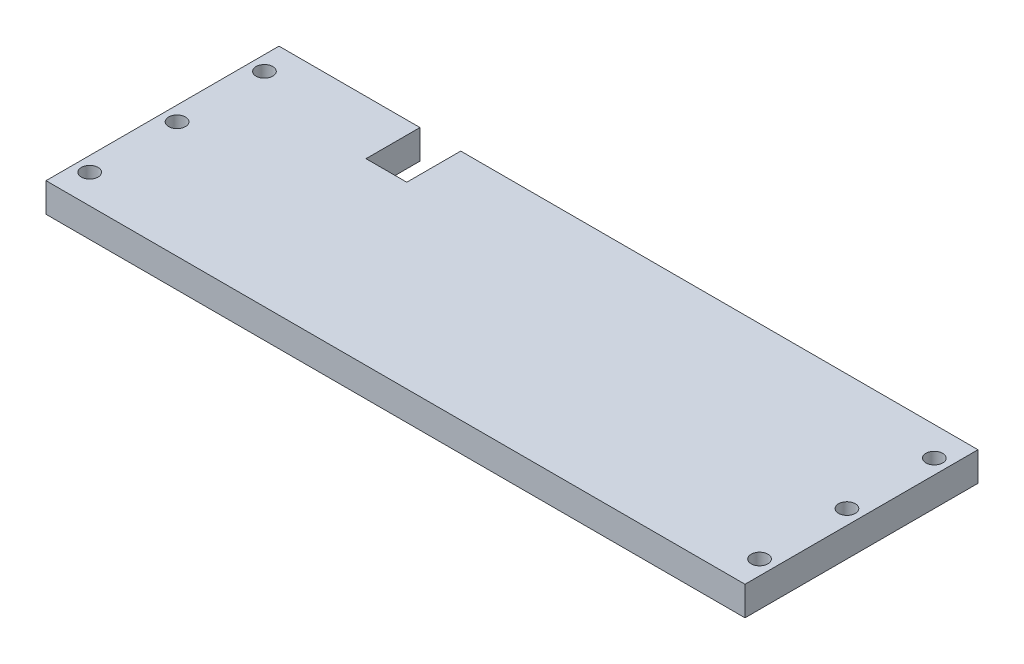
ISO-10303-21;
HEADER;
FILE_DESCRIPTION(('STEP AP214'),'2;1');
FILE_NAME('part.step','',(''),(''),'','','');
FILE_SCHEMA(('AUTOMOTIVE_DESIGN { 1 0 10303 214 1 1 1 1 }'));
ENDSEC;
DATA;
#1=APPLICATION_CONTEXT('core data for automotive mechanical design processes');
#2=APPLICATION_PROTOCOL_DEFINITION('international standard','automotive_design',2000,#1);
#3=PRODUCT_CONTEXT('',#1,'mechanical');
#4=PRODUCT('Part','Part','',(#3));
#5=PRODUCT_RELATED_PRODUCT_CATEGORY('part','',(#4));
#6=PRODUCT_DEFINITION_FORMATION('','',#4);
#7=PRODUCT_DEFINITION_CONTEXT('part definition',#1,'design');
#8=PRODUCT_DEFINITION('design','',#6,#7);
#9=PRODUCT_DEFINITION_SHAPE('','',#8);
#10=(LENGTH_UNIT() NAMED_UNIT(*) SI_UNIT(.MILLI.,.METRE.));
#11=(NAMED_UNIT(*) PLANE_ANGLE_UNIT() SI_UNIT($,.RADIAN.));
#12=(NAMED_UNIT(*) SI_UNIT($,.STERADIAN.) SOLID_ANGLE_UNIT());
#13=UNCERTAINTY_MEASURE_WITH_UNIT(LENGTH_MEASURE(1.E-05),#10,'distance_accuracy_value','');
#14=(GEOMETRIC_REPRESENTATION_CONTEXT(3) GLOBAL_UNCERTAINTY_ASSIGNED_CONTEXT((#13)) GLOBAL_UNIT_ASSIGNED_CONTEXT((#10,
#11,#12)) REPRESENTATION_CONTEXT('',''));
#15=CARTESIAN_POINT('',(0.,0.,0.));
#16=DIRECTION('',(0.,0.,1.));
#17=DIRECTION('',(1.,0.,0.));
#18=AXIS2_PLACEMENT_3D('',#15,#16,#17);
#19=CARTESIAN_POINT('',(0.,6.35,-50.8));
#20=DIRECTION('',(0.,0.,1.));
#21=DIRECTION('',(1.,0.,0.));
#22=AXIS2_PLACEMENT_3D('',#19,#20,#21);
#23=PLANE('',#22);
#24=DIRECTION('',(-1.,0.,0.));
#25=VECTOR('',#24,1.);
#26=CARTESIAN_POINT('',(0.,0.,-50.8));
#27=LINE('',#26,#25);
#28=CARTESIAN_POINT('',(0.,0.,-50.8));
#29=VERTEX_POINT('',#28);
#30=CARTESIAN_POINT('',(-112.776,0.,-50.8));
#31=VERTEX_POINT('',#30);
#32=EDGE_CURVE('E139',#29,#31,#27,.T.);
#33=ORIENTED_EDGE('',*,*,#32,.T.);
#34=DIRECTION('',(0.,1.,0.));
#35=VECTOR('',#34,1.);
#36=CARTESIAN_POINT('',(-112.776,0.,-50.8));
#37=LINE('',#36,#35);
#38=CARTESIAN_POINT('',(-112.776,6.35,-50.8));
#39=VERTEX_POINT('',#38);
#40=EDGE_CURVE('E218',#31,#39,#37,.T.);
#41=ORIENTED_EDGE('',*,*,#40,.T.);
#42=DIRECTION('',(-1.,0.,0.));
#43=VECTOR('',#42,1.);
#44=CARTESIAN_POINT('',(0.,6.35,-50.8));
#45=LINE('',#44,#43);
#46=CARTESIAN_POINT('',(0.,6.35,-50.8));
#47=VERTEX_POINT('',#46);
#48=EDGE_CURVE('E91',#47,#39,#45,.T.);
#49=ORIENTED_EDGE('',*,*,#48,.F.);
#50=DIRECTION('',(0.,-1.,0.));
#51=VECTOR('',#50,1.);
#52=CARTESIAN_POINT('',(0.,6.35,-50.8));
#53=LINE('',#52,#51);
#54=EDGE_CURVE('E11',#47,#29,#53,.T.);
#55=ORIENTED_EDGE('',*,*,#54,.T.);
#56=EDGE_LOOP('',(#33,#41,#49,#55));
#57=FACE_BOUND('',#56,.T.);
#58=ADVANCED_FACE('F38',(#57),#23,.F.);
#59=CARTESIAN_POINT('',(0.,6.35,0.));
#60=DIRECTION('',(-1.,0.,0.));
#61=DIRECTION('',(0.,0.,1.));
#62=AXIS2_PLACEMENT_3D('',#59,#60,#61);
#63=PLANE('',#62);
#64=DIRECTION('',(0.,0.,-1.));
#65=VECTOR('',#64,1.);
#66=CARTESIAN_POINT('',(0.,0.,0.));
#67=LINE('',#66,#65);
#68=CARTESIAN_POINT('',(0.,0.,0.));
#69=VERTEX_POINT('',#68);
#70=EDGE_CURVE('E140',#69,#29,#67,.T.);
#71=ORIENTED_EDGE('',*,*,#70,.T.);
#72=ORIENTED_EDGE('',*,*,#54,.F.);
#73=DIRECTION('',(0.,0.,-1.));
#74=VECTOR('',#73,1.);
#75=CARTESIAN_POINT('',(0.,6.35,0.));
#76=LINE('',#75,#74);
#77=CARTESIAN_POINT('',(0.,6.35,0.));
#78=VERTEX_POINT('',#77);
#79=EDGE_CURVE('E154',#78,#47,#76,.T.);
#80=ORIENTED_EDGE('',*,*,#79,.F.);
#81=DIRECTION('',(0.,-1.,0.));
#82=VECTOR('',#81,1.);
#83=CARTESIAN_POINT('',(0.,6.35,0.));
#84=LINE('',#83,#82);
#85=EDGE_CURVE('E155',#78,#69,#84,.T.);
#86=ORIENTED_EDGE('',*,*,#85,.T.);
#87=EDGE_LOOP('',(#71,#72,#80,#86));
#88=FACE_BOUND('',#87,.T.);
#89=ADVANCED_FACE('F40',(#88),#63,.F.);
#90=CARTESIAN_POINT('',(-121.666,6.35,-50.8));
#91=VERTEX_POINT('',#90);
#92=CARTESIAN_POINT('',(-152.4,6.35,-50.8));
#93=VERTEX_POINT('',#92);
#94=EDGE_CURVE('E131',#91,#93,#45,.T.);
#95=ORIENTED_EDGE('',*,*,#94,.F.);
#96=DIRECTION('',(0.,1.,0.));
#97=VECTOR('',#96,1.);
#98=CARTESIAN_POINT('',(-121.666,0.,-50.8));
#99=LINE('',#98,#97);
#100=CARTESIAN_POINT('',(-121.666,0.,-50.8));
#101=VERTEX_POINT('',#100);
#102=EDGE_CURVE('E117',#101,#91,#99,.T.);
#103=ORIENTED_EDGE('',*,*,#102,.F.);
#104=CARTESIAN_POINT('',(-152.4,0.,-50.8));
#105=VERTEX_POINT('',#104);
#106=EDGE_CURVE('E129',#101,#105,#27,.T.);
#107=ORIENTED_EDGE('',*,*,#106,.T.);
#108=DIRECTION('',(0.,-1.,0.));
#109=VECTOR('',#108,1.);
#110=CARTESIAN_POINT('',(-152.4,6.35,-50.8));
#111=LINE('',#110,#109);
#112=EDGE_CURVE('E47',#93,#105,#111,.T.);
#113=ORIENTED_EDGE('',*,*,#112,.F.);
#114=EDGE_LOOP('',(#95,#103,#107,#113));
#115=FACE_BOUND('',#114,.T.);
#116=ADVANCED_FACE('F127',(#115),#23,.F.);
#117=CARTESIAN_POINT('',(-152.4,6.35,0.));
#118=DIRECTION('',(1.,0.,0.));
#119=DIRECTION('',(0.,0.,-1.));
#120=AXIS2_PLACEMENT_3D('',#117,#118,#119);
#121=PLANE('',#120);
#122=DIRECTION('',(0.,0.,1.));
#123=VECTOR('',#122,1.);
#124=CARTESIAN_POINT('',(-152.4,0.,0.));
#125=LINE('',#124,#123);
#126=CARTESIAN_POINT('',(-152.4,0.,0.));
#127=VERTEX_POINT('',#126);
#128=EDGE_CURVE('E137',#105,#127,#125,.T.);
#129=ORIENTED_EDGE('',*,*,#128,.T.);
#130=DIRECTION('',(0.,-1.,0.));
#131=VECTOR('',#130,1.);
#132=CARTESIAN_POINT('',(-152.4,6.35,0.));
#133=LINE('',#132,#131);
#134=CARTESIAN_POINT('',(-152.4,6.35,0.));
#135=VERTEX_POINT('',#134);
#136=EDGE_CURVE('E158',#135,#127,#133,.T.);
#137=ORIENTED_EDGE('',*,*,#136,.F.);
#138=DIRECTION('',(0.,0.,1.));
#139=VECTOR('',#138,1.);
#140=CARTESIAN_POINT('',(-152.4,6.35,0.));
#141=LINE('',#140,#139);
#142=EDGE_CURVE('E165',#93,#135,#141,.T.);
#143=ORIENTED_EDGE('',*,*,#142,.F.);
#144=ORIENTED_EDGE('',*,*,#112,.T.);
#145=EDGE_LOOP('',(#129,#137,#143,#144));
#146=FACE_BOUND('',#145,.T.);
#147=ADVANCED_FACE('F163',(#146),#121,.F.);
#148=CARTESIAN_POINT('',(0.,6.35,0.));
#149=DIRECTION('',(0.,0.,-1.));
#150=DIRECTION('',(-1.,0.,0.));
#151=AXIS2_PLACEMENT_3D('',#148,#149,#150);
#152=PLANE('',#151);
#153=DIRECTION('',(1.,0.,0.));
#154=VECTOR('',#153,1.);
#155=CARTESIAN_POINT('',(0.,0.,0.));
#156=LINE('',#155,#154);
#157=EDGE_CURVE('E84',#127,#69,#156,.T.);
#158=ORIENTED_EDGE('',*,*,#157,.T.);
#159=ORIENTED_EDGE('',*,*,#85,.F.);
#160=DIRECTION('',(1.,0.,0.));
#161=VECTOR('',#160,1.);
#162=CARTESIAN_POINT('',(0.,6.35,0.));
#163=LINE('',#162,#161);
#164=EDGE_CURVE('E63',#135,#78,#163,.T.);
#165=ORIENTED_EDGE('',*,*,#164,.F.);
#166=ORIENTED_EDGE('',*,*,#136,.T.);
#167=EDGE_LOOP('',(#158,#159,#165,#166));
#168=FACE_BOUND('',#167,.T.);
#169=ADVANCED_FACE('F248',(#168),#152,.F.);
#170=CARTESIAN_POINT('',(0.,6.35,0.));
#171=DIRECTION('',(0.,1.,0.));
#172=DIRECTION('',(0.,0.,1.));
#173=AXIS2_PLACEMENT_3D('',#170,#171,#172);
#174=PLANE('',#173);
#175=DIRECTION('',(0.,0.,-1.));
#176=VECTOR('',#175,1.);
#177=CARTESIAN_POINT('',(-112.776,6.35,-39.0349884222713));
#178=LINE('',#177,#176);
#179=CARTESIAN_POINT('',(-112.776,6.35,-39.0349884222713));
#180=VERTEX_POINT('',#179);
#181=EDGE_CURVE('E123',#180,#39,#178,.T.);
#182=ORIENTED_EDGE('',*,*,#181,.F.);
#183=DIRECTION('',(1.,0.,0.));
#184=VECTOR('',#183,1.);
#185=CARTESIAN_POINT('',(-121.666,6.35,-39.0349884222713));
#186=LINE('',#185,#184);
#187=CARTESIAN_POINT('',(-121.666,6.35,-39.0349884222713));
#188=VERTEX_POINT('',#187);
#189=EDGE_CURVE('E231',#188,#180,#186,.T.);
#190=ORIENTED_EDGE('',*,*,#189,.F.);
#191=DIRECTION('',(0.,0.,1.));
#192=VECTOR('',#191,1.);
#193=CARTESIAN_POINT('',(-121.666,6.35,-50.8));
#194=LINE('',#193,#192);
#195=EDGE_CURVE('E235',#91,#188,#194,.T.);
#196=ORIENTED_EDGE('',*,*,#195,.F.);
#197=ORIENTED_EDGE('',*,*,#94,.T.);
#198=ORIENTED_EDGE('',*,*,#142,.T.);
#199=ORIENTED_EDGE('',*,*,#164,.T.);
#200=ORIENTED_EDGE('',*,*,#79,.T.);
#201=ORIENTED_EDGE('',*,*,#48,.T.);
#202=EDGE_LOOP('',(#182,#190,#196,#197,#198,#199,#200,#201));
#203=FACE_BOUND('',#202,.T.);
#204=CARTESIAN_POINT('',(-149.225,6.35,-25.4));
#205=DIRECTION('',(0.,1.,0.));
#206=DIRECTION('',(0.,0.,1.));
#207=AXIS2_PLACEMENT_3D('',#204,#205,#206);
#208=CIRCLE('',#207,1.82879999999998);
#209=CARTESIAN_POINT('',(-149.225,6.35,-23.5712));
#210=VERTEX_POINT('',#209);
#211=EDGE_CURVE('E207',#210,#210,#208,.T.);
#212=ORIENTED_EDGE('',*,*,#211,.F.);
#213=EDGE_LOOP('',(#212));
#214=FACE_BOUND('',#213,.T.);
#215=CARTESIAN_POINT('',(-149.225,6.35,-6.35));
#216=DIRECTION('',(0.,1.,0.));
#217=DIRECTION('',(0.,0.,1.));
#218=AXIS2_PLACEMENT_3D('',#215,#216,#217);
#219=CIRCLE('',#218,1.82879999999998);
#220=CARTESIAN_POINT('',(-149.225,6.35,-4.52120000000002));
#221=VERTEX_POINT('',#220);
#222=EDGE_CURVE('E199',#221,#221,#219,.T.);
#223=ORIENTED_EDGE('',*,*,#222,.F.);
#224=EDGE_LOOP('',(#223));
#225=FACE_BOUND('',#224,.T.);
#226=CARTESIAN_POINT('',(-3.175,6.35,-25.4));
#227=DIRECTION('',(0.,1.,0.));
#228=DIRECTION('',(0.,0.,1.));
#229=AXIS2_PLACEMENT_3D('',#226,#227,#228);
#230=CIRCLE('',#229,1.8288);
#231=CARTESIAN_POINT('',(-3.175,6.35,-23.5712));
#232=VERTEX_POINT('',#231);
#233=EDGE_CURVE('E191',#232,#232,#230,.T.);
#234=ORIENTED_EDGE('',*,*,#233,.F.);
#235=EDGE_LOOP('',(#234));
#236=FACE_BOUND('',#235,.T.);
#237=CARTESIAN_POINT('',(-3.175,6.35,-44.45));
#238=DIRECTION('',(0.,1.,0.));
#239=DIRECTION('',(0.,0.,1.));
#240=AXIS2_PLACEMENT_3D('',#237,#238,#239);
#241=CIRCLE('',#240,1.8288);
#242=CARTESIAN_POINT('',(-3.175,6.35,-42.6212));
#243=VERTEX_POINT('',#242);
#244=EDGE_CURVE('E182',#243,#243,#241,.T.);
#245=ORIENTED_EDGE('',*,*,#244,.F.);
#246=EDGE_LOOP('',(#245));
#247=FACE_BOUND('',#246,.T.);
#248=CARTESIAN_POINT('',(-3.175,6.35,-6.35));
#249=DIRECTION('',(0.,1.,0.));
#250=DIRECTION('',(0.,0.,1.));
#251=AXIS2_PLACEMENT_3D('',#248,#249,#250);
#252=CIRCLE('',#251,1.8288);
#253=CARTESIAN_POINT('',(-3.175,6.35,-4.5212));
#254=VERTEX_POINT('',#253);
#255=EDGE_CURVE('E214',#254,#254,#252,.T.);
#256=ORIENTED_EDGE('',*,*,#255,.F.);
#257=EDGE_LOOP('',(#256));
#258=FACE_BOUND('',#257,.T.);
#259=CARTESIAN_POINT('',(-149.225,6.35,-44.45));
#260=DIRECTION('',(0.,1.,0.));
#261=DIRECTION('',(0.,0.,1.));
#262=AXIS2_PLACEMENT_3D('',#259,#260,#261);
#263=CIRCLE('',#262,1.82879999999999);
#264=CARTESIAN_POINT('',(-149.225,6.35,-42.6212));
#265=VERTEX_POINT('',#264);
#266=EDGE_CURVE('E174',#265,#265,#263,.T.);
#267=ORIENTED_EDGE('',*,*,#266,.F.);
#268=EDGE_LOOP('',(#267));
#269=FACE_BOUND('',#268,.T.);
#270=ADVANCED_FACE('F250',(#203,#214,#225,#236,#247,#258,#269),#174,.T.);
#271=CARTESIAN_POINT('',(0.,0.,0.));
#272=DIRECTION('',(0.,1.,0.));
#273=DIRECTION('',(0.,0.,1.));
#274=AXIS2_PLACEMENT_3D('',#271,#272,#273);
#275=PLANE('',#274);
#276=CARTESIAN_POINT('',(-149.225,0.,-25.4));
#277=DIRECTION('',(0.,1.,0.));
#278=DIRECTION('',(0.,0.,1.));
#279=AXIS2_PLACEMENT_3D('',#276,#277,#278);
#280=CIRCLE('',#279,1.82879999999998);
#281=CARTESIAN_POINT('',(-149.225,0.,-23.5712));
#282=VERTEX_POINT('',#281);
#283=EDGE_CURVE('E178',#282,#282,#280,.T.);
#284=ORIENTED_EDGE('',*,*,#283,.T.);
#285=EDGE_LOOP('',(#284));
#286=FACE_BOUND('',#285,.T.);
#287=CARTESIAN_POINT('',(-149.225,0.,-6.35));
#288=DIRECTION('',(0.,1.,0.));
#289=DIRECTION('',(0.,0.,1.));
#290=AXIS2_PLACEMENT_3D('',#287,#288,#289);
#291=CIRCLE('',#290,1.82879999999998);
#292=CARTESIAN_POINT('',(-149.225,0.,-4.52120000000002));
#293=VERTEX_POINT('',#292);
#294=EDGE_CURVE('E203',#293,#293,#291,.T.);
#295=ORIENTED_EDGE('',*,*,#294,.T.);
#296=EDGE_LOOP('',(#295));
#297=FACE_BOUND('',#296,.T.);
#298=CARTESIAN_POINT('',(-3.175,0.,-25.4));
#299=DIRECTION('',(0.,1.,0.));
#300=DIRECTION('',(0.,0.,1.));
#301=AXIS2_PLACEMENT_3D('',#298,#299,#300);
#302=CIRCLE('',#301,1.8288);
#303=CARTESIAN_POINT('',(-3.175,0.,-23.5712));
#304=VERTEX_POINT('',#303);
#305=EDGE_CURVE('E195',#304,#304,#302,.T.);
#306=ORIENTED_EDGE('',*,*,#305,.T.);
#307=EDGE_LOOP('',(#306));
#308=FACE_BOUND('',#307,.T.);
#309=CARTESIAN_POINT('',(-3.175,0.,-44.45));
#310=DIRECTION('',(0.,1.,0.));
#311=DIRECTION('',(0.,0.,1.));
#312=AXIS2_PLACEMENT_3D('',#309,#310,#311);
#313=CIRCLE('',#312,1.8288);
#314=CARTESIAN_POINT('',(-3.175,0.,-42.6212));
#315=VERTEX_POINT('',#314);
#316=EDGE_CURVE('E186',#315,#315,#313,.T.);
#317=ORIENTED_EDGE('',*,*,#316,.T.);
#318=EDGE_LOOP('',(#317));
#319=FACE_BOUND('',#318,.T.);
#320=CARTESIAN_POINT('',(-3.175,0.,-6.35));
#321=DIRECTION('',(0.,1.,0.));
#322=DIRECTION('',(0.,0.,1.));
#323=AXIS2_PLACEMENT_3D('',#320,#321,#322);
#324=CIRCLE('',#323,1.8288);
#325=CARTESIAN_POINT('',(-3.175,0.,-4.5212));
#326=VERTEX_POINT('',#325);
#327=EDGE_CURVE('E187',#326,#326,#324,.T.);
#328=ORIENTED_EDGE('',*,*,#327,.T.);
#329=EDGE_LOOP('',(#328));
#330=FACE_BOUND('',#329,.T.);
#331=CARTESIAN_POINT('',(-149.225,0.,-44.45));
#332=DIRECTION('',(0.,1.,0.));
#333=DIRECTION('',(0.,0.,1.));
#334=AXIS2_PLACEMENT_3D('',#331,#332,#333);
#335=CIRCLE('',#334,1.82879999999999);
#336=CARTESIAN_POINT('',(-149.225,0.,-42.6212));
#337=VERTEX_POINT('',#336);
#338=EDGE_CURVE('E146',#337,#337,#335,.T.);
#339=ORIENTED_EDGE('',*,*,#338,.T.);
#340=EDGE_LOOP('',(#339));
#341=FACE_BOUND('',#340,.T.);
#342=DIRECTION('',(1.,0.,0.));
#343=VECTOR('',#342,1.);
#344=CARTESIAN_POINT('',(-121.666,0.,-39.0349884222713));
#345=LINE('',#344,#343);
#346=CARTESIAN_POINT('',(-121.666,0.,-39.0349884222713));
#347=VERTEX_POINT('',#346);
#348=CARTESIAN_POINT('',(-112.776,0.,-39.0349884222713));
#349=VERTEX_POINT('',#348);
#350=EDGE_CURVE('E54',#347,#349,#345,.T.);
#351=ORIENTED_EDGE('',*,*,#350,.T.);
#352=DIRECTION('',(0.,0.,-1.));
#353=VECTOR('',#352,1.);
#354=CARTESIAN_POINT('',(-112.776,0.,-39.0349884222713));
#355=LINE('',#354,#353);
#356=EDGE_CURVE('E133',#349,#31,#355,.T.);
#357=ORIENTED_EDGE('',*,*,#356,.T.);
#358=ORIENTED_EDGE('',*,*,#32,.F.);
#359=ORIENTED_EDGE('',*,*,#70,.F.);
#360=ORIENTED_EDGE('',*,*,#157,.F.);
#361=ORIENTED_EDGE('',*,*,#128,.F.);
#362=ORIENTED_EDGE('',*,*,#106,.F.);
#363=DIRECTION('',(0.,0.,1.));
#364=VECTOR('',#363,1.);
#365=CARTESIAN_POINT('',(-121.666,0.,-50.8));
#366=LINE('',#365,#364);
#367=EDGE_CURVE('E113',#101,#347,#366,.T.);
#368=ORIENTED_EDGE('',*,*,#367,.T.);
#369=EDGE_LOOP('',(#351,#357,#358,#359,#360,#361,#362,#368));
#370=FACE_BOUND('',#369,.T.);
#371=ADVANCED_FACE('F136',(#286,#297,#308,#319,#330,#341,#370),#275,.F.);
#372=CARTESIAN_POINT('',(-149.225,0.,-44.45));
#373=DIRECTION('',(0.,1.,0.));
#374=DIRECTION('',(0.,0.,1.));
#375=AXIS2_PLACEMENT_3D('',#372,#373,#374);
#376=CYLINDRICAL_SURFACE('',#375,1.82879999999999);
#377=ORIENTED_EDGE('',*,*,#338,.F.);
#378=EDGE_LOOP('',(#377));
#379=FACE_BOUND('',#378,.T.);
#380=ORIENTED_EDGE('',*,*,#266,.T.);
#381=EDGE_LOOP('',(#380));
#382=FACE_BOUND('',#381,.T.);
#383=ADVANCED_FACE('F277',(#379,#382),#376,.F.);
#384=CARTESIAN_POINT('',(-3.175,0.,-6.35));
#385=DIRECTION('',(0.,1.,0.));
#386=DIRECTION('',(0.,0.,1.));
#387=AXIS2_PLACEMENT_3D('',#384,#385,#386);
#388=CYLINDRICAL_SURFACE('',#387,1.8288);
#389=ORIENTED_EDGE('',*,*,#327,.F.);
#390=EDGE_LOOP('',(#389));
#391=FACE_BOUND('',#390,.T.);
#392=ORIENTED_EDGE('',*,*,#255,.T.);
#393=EDGE_LOOP('',(#392));
#394=FACE_BOUND('',#393,.T.);
#395=ADVANCED_FACE('F310',(#391,#394),#388,.F.);
#396=CARTESIAN_POINT('',(-3.175,0.,-44.45));
#397=DIRECTION('',(0.,1.,0.));
#398=DIRECTION('',(0.,0.,1.));
#399=AXIS2_PLACEMENT_3D('',#396,#397,#398);
#400=CYLINDRICAL_SURFACE('',#399,1.8288);
#401=ORIENTED_EDGE('',*,*,#316,.F.);
#402=EDGE_LOOP('',(#401));
#403=FACE_BOUND('',#402,.T.);
#404=ORIENTED_EDGE('',*,*,#244,.T.);
#405=EDGE_LOOP('',(#404));
#406=FACE_BOUND('',#405,.T.);
#407=ADVANCED_FACE('F313',(#403,#406),#400,.F.);
#408=CARTESIAN_POINT('',(-3.175,0.,-25.4));
#409=DIRECTION('',(0.,1.,0.));
#410=DIRECTION('',(0.,0.,1.));
#411=AXIS2_PLACEMENT_3D('',#408,#409,#410);
#412=CYLINDRICAL_SURFACE('',#411,1.8288);
#413=ORIENTED_EDGE('',*,*,#305,.F.);
#414=EDGE_LOOP('',(#413));
#415=FACE_BOUND('',#414,.T.);
#416=ORIENTED_EDGE('',*,*,#233,.T.);
#417=EDGE_LOOP('',(#416));
#418=FACE_BOUND('',#417,.T.);
#419=ADVANCED_FACE('F321',(#415,#418),#412,.F.);
#420=CARTESIAN_POINT('',(-149.225,0.,-6.35));
#421=DIRECTION('',(0.,1.,0.));
#422=DIRECTION('',(0.,0.,1.));
#423=AXIS2_PLACEMENT_3D('',#420,#421,#422);
#424=CYLINDRICAL_SURFACE('',#423,1.82879999999998);
#425=ORIENTED_EDGE('',*,*,#294,.F.);
#426=EDGE_LOOP('',(#425));
#427=FACE_BOUND('',#426,.T.);
#428=ORIENTED_EDGE('',*,*,#222,.T.);
#429=EDGE_LOOP('',(#428));
#430=FACE_BOUND('',#429,.T.);
#431=ADVANCED_FACE('F317',(#427,#430),#424,.F.);
#432=CARTESIAN_POINT('',(-149.225,0.,-25.4));
#433=DIRECTION('',(0.,1.,0.));
#434=DIRECTION('',(0.,0.,1.));
#435=AXIS2_PLACEMENT_3D('',#432,#433,#434);
#436=CYLINDRICAL_SURFACE('',#435,1.82879999999998);
#437=ORIENTED_EDGE('',*,*,#283,.F.);
#438=EDGE_LOOP('',(#437));
#439=FACE_BOUND('',#438,.T.);
#440=ORIENTED_EDGE('',*,*,#211,.T.);
#441=EDGE_LOOP('',(#440));
#442=FACE_BOUND('',#441,.T.);
#443=ADVANCED_FACE('F288',(#439,#442),#436,.F.);
#444=CARTESIAN_POINT('',(-112.776,0.,-39.0349884222713));
#445=DIRECTION('',(1.,0.,0.));
#446=DIRECTION('',(0.,0.,-1.));
#447=AXIS2_PLACEMENT_3D('',#444,#445,#446);
#448=PLANE('',#447);
#449=ORIENTED_EDGE('',*,*,#181,.T.);
#450=ORIENTED_EDGE('',*,*,#40,.F.);
#451=ORIENTED_EDGE('',*,*,#356,.F.);
#452=DIRECTION('',(0.,1.,0.));
#453=VECTOR('',#452,1.);
#454=CARTESIAN_POINT('',(-112.776,0.,-39.0349884222713));
#455=LINE('',#454,#453);
#456=EDGE_CURVE('E224',#349,#180,#455,.T.);
#457=ORIENTED_EDGE('',*,*,#456,.T.);
#458=EDGE_LOOP('',(#449,#450,#451,#457));
#459=FACE_BOUND('',#458,.T.);
#460=ADVANCED_FACE('F282',(#459),#448,.F.);
#461=CARTESIAN_POINT('',(-121.666,0.,-39.0349884222713));
#462=DIRECTION('',(0.,0.,1.));
#463=DIRECTION('',(1.,0.,0.));
#464=AXIS2_PLACEMENT_3D('',#461,#462,#463);
#465=PLANE('',#464);
#466=ORIENTED_EDGE('',*,*,#189,.T.);
#467=ORIENTED_EDGE('',*,*,#456,.F.);
#468=ORIENTED_EDGE('',*,*,#350,.F.);
#469=DIRECTION('',(0.,1.,0.));
#470=VECTOR('',#469,1.);
#471=CARTESIAN_POINT('',(-121.666,0.,-39.0349884222713));
#472=LINE('',#471,#470);
#473=EDGE_CURVE('E119',#347,#188,#472,.T.);
#474=ORIENTED_EDGE('',*,*,#473,.T.);
#475=EDGE_LOOP('',(#466,#467,#468,#474));
#476=FACE_BOUND('',#475,.T.);
#477=ADVANCED_FACE('F287',(#476),#465,.F.);
#478=CARTESIAN_POINT('',(-121.666,0.,-50.8));
#479=DIRECTION('',(-1.,0.,0.));
#480=DIRECTION('',(0.,0.,1.));
#481=AXIS2_PLACEMENT_3D('',#478,#479,#480);
#482=PLANE('',#481);
#483=ORIENTED_EDGE('',*,*,#195,.T.);
#484=ORIENTED_EDGE('',*,*,#473,.F.);
#485=ORIENTED_EDGE('',*,*,#367,.F.);
#486=ORIENTED_EDGE('',*,*,#102,.T.);
#487=EDGE_LOOP('',(#483,#484,#485,#486));
#488=FACE_BOUND('',#487,.T.);
#489=ADVANCED_FACE('F116',(#488),#482,.F.);
#490=CLOSED_SHELL('',(#58,#89,#116,#147,#169,#270,#371,#383,#395,#407,#419,#431,#443,#460,#477,#489));
#491=MANIFOLD_SOLID_BREP('B2',#490);
#492=ADVANCED_BREP_SHAPE_REPRESENTATION('',(#18,#491),#14);
#493=SHAPE_DEFINITION_REPRESENTATION(#9,#492);
ENDSEC;
END-ISO-10303-21;
